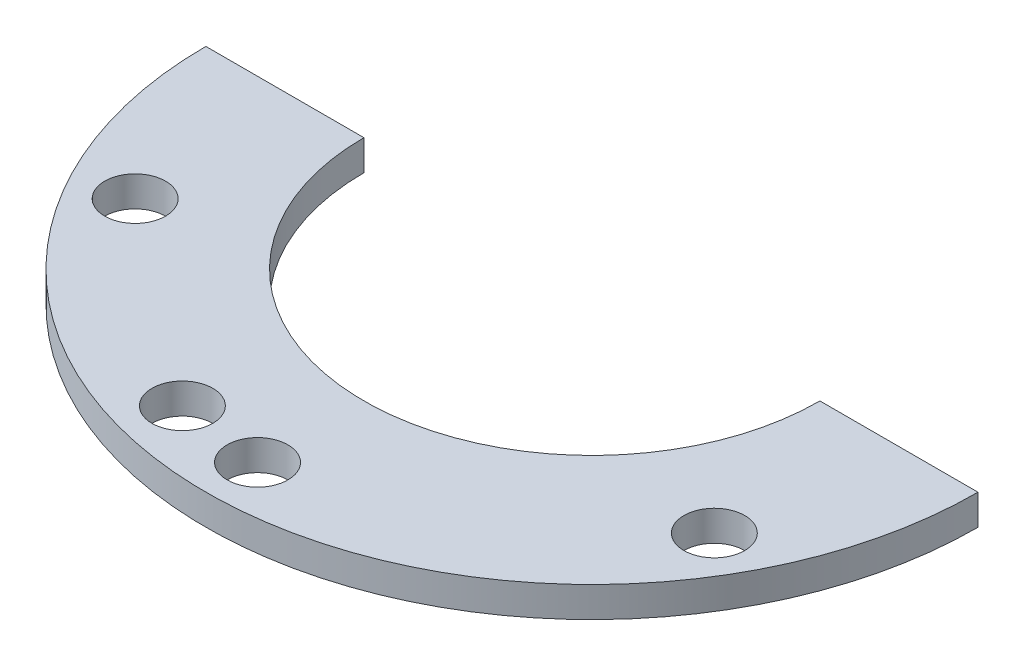
ISO-10303-21;
HEADER;
FILE_DESCRIPTION(('STEP AP214'),'2;1');
FILE_NAME('part.step','',(''),(''),'','','');
FILE_SCHEMA(('AUTOMOTIVE_DESIGN { 1 0 10303 214 1 1 1 1 }'));
ENDSEC;
DATA;
#1=APPLICATION_CONTEXT('core data for automotive mechanical design processes');
#2=APPLICATION_PROTOCOL_DEFINITION('international standard','automotive_design',2000,#1);
#3=PRODUCT_CONTEXT('',#1,'mechanical');
#4=PRODUCT('Part','Part','',(#3));
#5=PRODUCT_RELATED_PRODUCT_CATEGORY('part','',(#4));
#6=PRODUCT_DEFINITION_FORMATION('','',#4);
#7=PRODUCT_DEFINITION_CONTEXT('part definition',#1,'design');
#8=PRODUCT_DEFINITION('design','',#6,#7);
#9=PRODUCT_DEFINITION_SHAPE('','',#8);
#10=(LENGTH_UNIT() NAMED_UNIT(*) SI_UNIT(.MILLI.,.METRE.));
#11=(NAMED_UNIT(*) PLANE_ANGLE_UNIT() SI_UNIT($,.RADIAN.));
#12=(NAMED_UNIT(*) SI_UNIT($,.STERADIAN.) SOLID_ANGLE_UNIT());
#13=UNCERTAINTY_MEASURE_WITH_UNIT(LENGTH_MEASURE(1.E-05),#10,'distance_accuracy_value','');
#14=(GEOMETRIC_REPRESENTATION_CONTEXT(3) GLOBAL_UNCERTAINTY_ASSIGNED_CONTEXT((#13)) GLOBAL_UNIT_ASSIGNED_CONTEXT((#10,
#11,#12)) REPRESENTATION_CONTEXT('',''));
#15=CARTESIAN_POINT('',(0.,0.,0.));
#16=DIRECTION('',(0.,0.,1.));
#17=DIRECTION('',(1.,0.,0.));
#18=AXIS2_PLACEMENT_3D('',#15,#16,#17);
#19=CARTESIAN_POINT('',(0.,1.,0.));
#20=DIRECTION('',(0.,-1.,0.));
#21=DIRECTION('',(0.,0.,-1.));
#22=AXIS2_PLACEMENT_3D('',#19,#20,#21);
#23=CYLINDRICAL_SURFACE('',#22,12.7);
#24=CARTESIAN_POINT('',(0.,1.,0.));
#25=DIRECTION('',(0.,1.,0.));
#26=DIRECTION('',(0.,0.,1.));
#27=AXIS2_PLACEMENT_3D('',#24,#25,#26);
#28=CIRCLE('',#27,12.7);
#29=CARTESIAN_POINT('',(-12.7,1.,0.));
#30=VERTEX_POINT('',#29);
#31=CARTESIAN_POINT('',(12.7,1.,0.));
#32=VERTEX_POINT('',#31);
#33=EDGE_CURVE('E78',#30,#32,#28,.T.);
#34=ORIENTED_EDGE('',*,*,#33,.F.);
#35=DIRECTION('',(0.,-1.,0.));
#36=VECTOR('',#35,1.);
#37=CARTESIAN_POINT('',(-12.7,1.,0.));
#38=LINE('',#37,#36);
#39=CARTESIAN_POINT('',(-12.7,0.,0.));
#40=VERTEX_POINT('',#39);
#41=EDGE_CURVE('E121',#30,#40,#38,.T.);
#42=ORIENTED_EDGE('',*,*,#41,.T.);
#43=CARTESIAN_POINT('',(0.,0.,0.));
#44=DIRECTION('',(0.,1.,0.));
#45=DIRECTION('',(0.,0.,1.));
#46=AXIS2_PLACEMENT_3D('',#43,#44,#45);
#47=CIRCLE('',#46,12.7);
#48=CARTESIAN_POINT('',(12.7,0.,0.));
#49=VERTEX_POINT('',#48);
#50=EDGE_CURVE('E86',#40,#49,#47,.T.);
#51=ORIENTED_EDGE('',*,*,#50,.T.);
#52=DIRECTION('',(0.,-1.,0.));
#53=VECTOR('',#52,1.);
#54=CARTESIAN_POINT('',(12.7,1.,0.));
#55=LINE('',#54,#53);
#56=EDGE_CURVE('E91',#49,#32,#55,.F.);
#57=ORIENTED_EDGE('',*,*,#56,.T.);
#58=EDGE_LOOP('',(#34,#42,#51,#57));
#59=FACE_BOUND('',#58,.T.);
#60=ADVANCED_FACE('F34',(#59),#23,.T.);
#61=CARTESIAN_POINT('',(0.,1.,0.));
#62=DIRECTION('',(0.,1.,0.));
#63=DIRECTION('',(0.,0.,1.));
#64=AXIS2_PLACEMENT_3D('',#61,#62,#63);
#65=PLANE('',#64);
#66=CARTESIAN_POINT('',(-2.84700949612715,1.,10.6251840891799));
#67=DIRECTION('',(0.,1.,0.));
#68=DIRECTION('',(0.,0.,1.));
#69=AXIS2_PLACEMENT_3D('',#66,#67,#68);
#70=CIRCLE('',#69,1.00000000000027);
#71=CARTESIAN_POINT('',(-2.84700949612715,1.,11.6251840891802));
#72=VERTEX_POINT('',#71);
#73=EDGE_CURVE('E87',#72,#72,#70,.T.);
#74=ORIENTED_EDGE('',*,*,#73,.F.);
#75=EDGE_LOOP('',(#74));
#76=FACE_BOUND('',#75,.T.);
#77=DIRECTION('',(1.,0.,0.));
#78=VECTOR('',#77,1.);
#79=CARTESIAN_POINT('',(0.,1.,0.));
#80=LINE('',#79,#78);
#81=CARTESIAN_POINT('',(-7.5,1.,0.));
#82=VERTEX_POINT('',#81);
#83=EDGE_CURVE('E55',#30,#82,#80,.T.);
#84=ORIENTED_EDGE('',*,*,#83,.F.);
#85=ORIENTED_EDGE('',*,*,#33,.T.);
#86=CARTESIAN_POINT('',(7.5,1.,0.));
#87=VERTEX_POINT('',#86);
#88=EDGE_CURVE('E96',#87,#32,#80,.T.);
#89=ORIENTED_EDGE('',*,*,#88,.F.);
#90=CARTESIAN_POINT('',(0.,1.,0.));
#91=DIRECTION('',(0.,1.,0.));
#92=DIRECTION('',(0.,0.,1.));
#93=AXIS2_PLACEMENT_3D('',#90,#91,#92);
#94=CIRCLE('',#93,7.5);
#95=EDGE_CURVE('E90',#82,#87,#94,.T.);
#96=ORIENTED_EDGE('',*,*,#95,.F.);
#97=EDGE_LOOP('',(#84,#85,#89,#96));
#98=FACE_BOUND('',#97,.T.);
#99=CARTESIAN_POINT('',(-9.52627944162812,1.,5.50000000000041));
#100=DIRECTION('',(0.,1.,0.));
#101=DIRECTION('',(0.,0.,1.));
#102=AXIS2_PLACEMENT_3D('',#99,#100,#101);
#103=CIRCLE('',#102,0.999999999999829);
#104=CARTESIAN_POINT('',(-9.52627944162812,1.,6.50000000000024));
#105=VERTEX_POINT('',#104);
#106=EDGE_CURVE('E114',#105,#105,#103,.T.);
#107=ORIENTED_EDGE('',*,*,#106,.F.);
#108=EDGE_LOOP('',(#107));
#109=FACE_BOUND('',#108,.T.);
#110=CARTESIAN_POINT('',(9.35222188245208E-13,1.,11.));
#111=DIRECTION('',(0.,1.,0.));
#112=DIRECTION('',(0.,0.,1.));
#113=AXIS2_PLACEMENT_3D('',#110,#111,#112);
#114=CIRCLE('',#113,0.999999999999467);
#115=CARTESIAN_POINT('',(9.35222188245208E-13,1.,11.9999999999995));
#116=VERTEX_POINT('',#115);
#117=EDGE_CURVE('E111',#116,#116,#114,.T.);
#118=ORIENTED_EDGE('',*,*,#117,.F.);
#119=EDGE_LOOP('',(#118));
#120=FACE_BOUND('',#119,.T.);
#121=CARTESIAN_POINT('',(9.52627944162938,1.,5.49999999999958));
#122=DIRECTION('',(0.,1.,0.));
#123=DIRECTION('',(0.,0.,1.));
#124=AXIS2_PLACEMENT_3D('',#121,#122,#123);
#125=CIRCLE('',#124,0.999999999999871);
#126=CARTESIAN_POINT('',(9.52627944162938,1.,6.49999999999945));
#127=VERTEX_POINT('',#126);
#128=EDGE_CURVE('E106',#127,#127,#125,.T.);
#129=ORIENTED_EDGE('',*,*,#128,.F.);
#130=EDGE_LOOP('',(#129));
#131=FACE_BOUND('',#130,.T.);
#132=ADVANCED_FACE('F141',(#76,#98,#109,#120,#131),#65,.T.);
#133=CARTESIAN_POINT('',(0.,0.,0.));
#134=DIRECTION('',(0.,1.,0.));
#135=DIRECTION('',(0.,0.,1.));
#136=AXIS2_PLACEMENT_3D('',#133,#134,#135);
#137=PLANE('',#136);
#138=CARTESIAN_POINT('',(-2.84700949612715,0.,10.6251840891799));
#139=DIRECTION('',(0.,1.,0.));
#140=DIRECTION('',(0.,0.,1.));
#141=AXIS2_PLACEMENT_3D('',#138,#139,#140);
#142=CIRCLE('',#141,1.00000000000027);
#143=CARTESIAN_POINT('',(-2.84700949612715,0.,11.6251840891802));
#144=VERTEX_POINT('',#143);
#145=EDGE_CURVE('E126',#144,#144,#142,.T.);
#146=ORIENTED_EDGE('',*,*,#145,.T.);
#147=EDGE_LOOP('',(#146));
#148=FACE_BOUND('',#147,.T.);
#149=ORIENTED_EDGE('',*,*,#50,.F.);
#150=DIRECTION('',(1.,0.,0.));
#151=VECTOR('',#150,1.);
#152=CARTESIAN_POINT('',(0.,0.,0.));
#153=LINE('',#152,#151);
#154=CARTESIAN_POINT('',(-7.5,0.,0.));
#155=VERTEX_POINT('',#154);
#156=EDGE_CURVE('E72',#40,#155,#153,.T.);
#157=ORIENTED_EDGE('',*,*,#156,.T.);
#158=CARTESIAN_POINT('',(0.,0.,0.));
#159=DIRECTION('',(0.,1.,0.));
#160=DIRECTION('',(0.,0.,1.));
#161=AXIS2_PLACEMENT_3D('',#158,#159,#160);
#162=CIRCLE('',#161,7.5);
#163=CARTESIAN_POINT('',(7.5,0.,0.));
#164=VERTEX_POINT('',#163);
#165=EDGE_CURVE('E84',#155,#164,#162,.T.);
#166=ORIENTED_EDGE('',*,*,#165,.T.);
#167=EDGE_CURVE('E48',#164,#49,#153,.T.);
#168=ORIENTED_EDGE('',*,*,#167,.T.);
#169=EDGE_LOOP('',(#149,#157,#166,#168));
#170=FACE_BOUND('',#169,.T.);
#171=CARTESIAN_POINT('',(-9.52627944162812,0.,5.50000000000041));
#172=DIRECTION('',(0.,1.,0.));
#173=DIRECTION('',(0.,0.,1.));
#174=AXIS2_PLACEMENT_3D('',#171,#172,#173);
#175=CIRCLE('',#174,0.999999999999829);
#176=CARTESIAN_POINT('',(-9.52627944162812,0.,6.50000000000024));
#177=VERTEX_POINT('',#176);
#178=EDGE_CURVE('E93',#177,#177,#175,.T.);
#179=ORIENTED_EDGE('',*,*,#178,.T.);
#180=EDGE_LOOP('',(#179));
#181=FACE_BOUND('',#180,.T.);
#182=CARTESIAN_POINT('',(9.35222188245208E-13,0.,11.));
#183=DIRECTION('',(0.,1.,0.));
#184=DIRECTION('',(0.,0.,1.));
#185=AXIS2_PLACEMENT_3D('',#182,#183,#184);
#186=CIRCLE('',#185,0.999999999999467);
#187=CARTESIAN_POINT('',(9.35222188245208E-13,0.,11.9999999999995));
#188=VERTEX_POINT('',#187);
#189=EDGE_CURVE('E102',#188,#188,#186,.T.);
#190=ORIENTED_EDGE('',*,*,#189,.T.);
#191=EDGE_LOOP('',(#190));
#192=FACE_BOUND('',#191,.T.);
#193=CARTESIAN_POINT('',(9.52627944162938,0.,5.49999999999958));
#194=DIRECTION('',(0.,1.,0.));
#195=DIRECTION('',(0.,0.,1.));
#196=AXIS2_PLACEMENT_3D('',#193,#194,#195);
#197=CIRCLE('',#196,0.999999999999871);
#198=CARTESIAN_POINT('',(9.52627944162938,0.,6.49999999999945));
#199=VERTEX_POINT('',#198);
#200=EDGE_CURVE('E103',#199,#199,#197,.T.);
#201=ORIENTED_EDGE('',*,*,#200,.T.);
#202=EDGE_LOOP('',(#201));
#203=FACE_BOUND('',#202,.T.);
#204=ADVANCED_FACE('F82',(#148,#170,#181,#192,#203),#137,.F.);
#205=CARTESIAN_POINT('',(9.52627944162938,0.,5.49999999999958));
#206=DIRECTION('',(0.,1.,0.));
#207=DIRECTION('',(0.,0.,1.));
#208=AXIS2_PLACEMENT_3D('',#205,#206,#207);
#209=CYLINDRICAL_SURFACE('',#208,0.999999999999871);
#210=ORIENTED_EDGE('',*,*,#128,.T.);
#211=EDGE_LOOP('',(#210));
#212=FACE_BOUND('',#211,.T.);
#213=ORIENTED_EDGE('',*,*,#200,.F.);
#214=EDGE_LOOP('',(#213));
#215=FACE_BOUND('',#214,.T.);
#216=ADVANCED_FACE('F150',(#212,#215),#209,.F.);
#217=CARTESIAN_POINT('',(9.35222188245208E-13,0.,11.));
#218=DIRECTION('',(0.,1.,0.));
#219=DIRECTION('',(0.,0.,1.));
#220=AXIS2_PLACEMENT_3D('',#217,#218,#219);
#221=CYLINDRICAL_SURFACE('',#220,0.999999999999467);
#222=ORIENTED_EDGE('',*,*,#117,.T.);
#223=EDGE_LOOP('',(#222));
#224=FACE_BOUND('',#223,.T.);
#225=ORIENTED_EDGE('',*,*,#189,.F.);
#226=EDGE_LOOP('',(#225));
#227=FACE_BOUND('',#226,.T.);
#228=ADVANCED_FACE('F154',(#224,#227),#221,.F.);
#229=CARTESIAN_POINT('',(-9.52627944162812,0.,5.50000000000041));
#230=DIRECTION('',(0.,1.,0.));
#231=DIRECTION('',(0.,0.,1.));
#232=AXIS2_PLACEMENT_3D('',#229,#230,#231);
#233=CYLINDRICAL_SURFACE('',#232,0.999999999999829);
#234=ORIENTED_EDGE('',*,*,#106,.T.);
#235=EDGE_LOOP('',(#234));
#236=FACE_BOUND('',#235,.T.);
#237=ORIENTED_EDGE('',*,*,#178,.F.);
#238=EDGE_LOOP('',(#237));
#239=FACE_BOUND('',#238,.T.);
#240=ADVANCED_FACE('F157',(#236,#239),#233,.F.);
#241=CARTESIAN_POINT('',(0.,0.,0.));
#242=DIRECTION('',(0.,1.,0.));
#243=DIRECTION('',(0.,0.,1.));
#244=AXIS2_PLACEMENT_3D('',#241,#242,#243);
#245=CYLINDRICAL_SURFACE('',#244,7.5);
#246=ORIENTED_EDGE('',*,*,#95,.T.);
#247=DIRECTION('',(0.,1.,0.));
#248=VECTOR('',#247,1.);
#249=CARTESIAN_POINT('',(7.5,0.,0.));
#250=LINE('',#249,#248);
#251=EDGE_CURVE('E11',#87,#164,#250,.F.);
#252=ORIENTED_EDGE('',*,*,#251,.T.);
#253=ORIENTED_EDGE('',*,*,#165,.F.);
#254=DIRECTION('',(0.,1.,0.));
#255=VECTOR('',#254,1.);
#256=CARTESIAN_POINT('',(-7.5,0.,0.));
#257=LINE('',#256,#255);
#258=EDGE_CURVE('E41',#155,#82,#257,.T.);
#259=ORIENTED_EDGE('',*,*,#258,.T.);
#260=EDGE_LOOP('',(#246,#252,#253,#259));
#261=FACE_BOUND('',#260,.T.);
#262=ADVANCED_FACE('F89',(#261),#245,.F.);
#263=CARTESIAN_POINT('',(0.,0.,0.));
#264=DIRECTION('',(0.,0.,1.));
#265=DIRECTION('',(1.,0.,0.));
#266=AXIS2_PLACEMENT_3D('',#263,#264,#265);
#267=PLANE('',#266);
#268=ORIENTED_EDGE('',*,*,#83,.T.);
#269=ORIENTED_EDGE('',*,*,#258,.F.);
#270=ORIENTED_EDGE('',*,*,#156,.F.);
#271=ORIENTED_EDGE('',*,*,#41,.F.);
#272=EDGE_LOOP('',(#268,#269,#270,#271));
#273=FACE_BOUND('',#272,.T.);
#274=ADVANCED_FACE('F71',(#273),#267,.F.);
#275=ORIENTED_EDGE('',*,*,#167,.F.);
#276=ORIENTED_EDGE('',*,*,#251,.F.);
#277=ORIENTED_EDGE('',*,*,#88,.T.);
#278=ORIENTED_EDGE('',*,*,#56,.F.);
#279=EDGE_LOOP('',(#275,#276,#277,#278));
#280=FACE_BOUND('',#279,.T.);
#281=ADVANCED_FACE('F133',(#280),#267,.F.);
#282=CARTESIAN_POINT('',(-2.84700949612715,0.,10.6251840891799));
#283=DIRECTION('',(0.,1.,0.));
#284=DIRECTION('',(0.,0.,1.));
#285=AXIS2_PLACEMENT_3D('',#282,#283,#284);
#286=CYLINDRICAL_SURFACE('',#285,1.00000000000027);
#287=ORIENTED_EDGE('',*,*,#73,.T.);
#288=EDGE_LOOP('',(#287));
#289=FACE_BOUND('',#288,.T.);
#290=ORIENTED_EDGE('',*,*,#145,.F.);
#291=EDGE_LOOP('',(#290));
#292=FACE_BOUND('',#291,.T.);
#293=ADVANCED_FACE('F131',(#289,#292),#286,.F.);
#294=CLOSED_SHELL('',(#60,#132,#204,#216,#228,#240,#262,#274,#281,#293));
#295=MANIFOLD_SOLID_BREP('B2',#294);
#296=ADVANCED_BREP_SHAPE_REPRESENTATION('',(#18,#295),#14);
#297=SHAPE_DEFINITION_REPRESENTATION(#9,#296);
ENDSEC;
END-ISO-10303-21;
